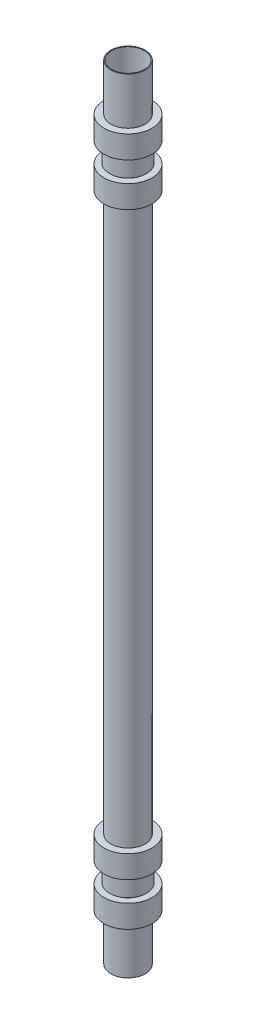
ISO-10303-21;
HEADER;
FILE_DESCRIPTION(('STEP AP214'),'2;1');
FILE_NAME('part.step','',(''),(''),'','','');
FILE_SCHEMA(('AUTOMOTIVE_DESIGN { 1 0 10303 214 1 1 1 1 }'));
ENDSEC;
DATA;
#1=APPLICATION_CONTEXT('core data for automotive mechanical design processes');
#2=APPLICATION_PROTOCOL_DEFINITION('international standard','automotive_design',2000,#1);
#3=PRODUCT_CONTEXT('',#1,'mechanical');
#4=PRODUCT('Part','Part','',(#3));
#5=PRODUCT_RELATED_PRODUCT_CATEGORY('part','',(#4));
#6=PRODUCT_DEFINITION_FORMATION('','',#4);
#7=PRODUCT_DEFINITION_CONTEXT('part definition',#1,'design');
#8=PRODUCT_DEFINITION('design','',#6,#7);
#9=PRODUCT_DEFINITION_SHAPE('','',#8);
#10=(LENGTH_UNIT() NAMED_UNIT(*) SI_UNIT(.MILLI.,.METRE.));
#11=(NAMED_UNIT(*) PLANE_ANGLE_UNIT() SI_UNIT($,.RADIAN.));
#12=(NAMED_UNIT(*) SI_UNIT($,.STERADIAN.) SOLID_ANGLE_UNIT());
#13=UNCERTAINTY_MEASURE_WITH_UNIT(LENGTH_MEASURE(1.E-05),#10,'distance_accuracy_value','');
#14=(GEOMETRIC_REPRESENTATION_CONTEXT(3) GLOBAL_UNCERTAINTY_ASSIGNED_CONTEXT((#13)) GLOBAL_UNIT_ASSIGNED_CONTEXT((#10,
#11,#12)) REPRESENTATION_CONTEXT('',''));
#15=CARTESIAN_POINT('',(0.,0.,0.));
#16=DIRECTION('',(0.,0.,1.));
#17=DIRECTION('',(1.,0.,0.));
#18=AXIS2_PLACEMENT_3D('',#15,#16,#17);
#19=CARTESIAN_POINT('',(0.,0.,0.));
#20=DIRECTION('',(0.,1.,0.));
#21=DIRECTION('',(0.,0.,1.));
#22=AXIS2_PLACEMENT_3D('',#19,#20,#21);
#23=CYLINDRICAL_SURFACE('',#22,34.0619900307438);
#24=CARTESIAN_POINT('',(0.,185.72,0.));
#25=DIRECTION('',(0.,1.,0.));
#26=DIRECTION('',(-1.,0.,0.));
#27=AXIS2_PLACEMENT_3D('',#24,#25,#26);
#28=CIRCLE('',#27,34.0619900307438);
#29=CARTESIAN_POINT('',(-34.0619900307438,185.72,0.));
#30=VERTEX_POINT('',#29);
#31=EDGE_CURVE('E120',#30,#30,#28,.F.);
#32=ORIENTED_EDGE('',*,*,#31,.T.);
#33=EDGE_LOOP('',(#32));
#34=FACE_BOUND('',#33,.T.);
#35=CARTESIAN_POINT('',(0.,1633.,0.));
#36=DIRECTION('',(0.,-1.,0.));
#37=DIRECTION('',(0.,0.,-1.));
#38=AXIS2_PLACEMENT_3D('',#35,#36,#37);
#39=CIRCLE('',#38,34.0619900307438);
#40=CARTESIAN_POINT('',(0.,1633.,-34.0619900307438));
#41=VERTEX_POINT('',#40);
#42=EDGE_CURVE('E52',#41,#41,#39,.T.);
#43=ORIENTED_EDGE('',*,*,#42,.F.);
#44=EDGE_LOOP('',(#43));
#45=FACE_BOUND('',#44,.T.);
#46=ADVANCED_FACE('F34',(#34,#45),#23,.F.);
#47=CARTESIAN_POINT('',(0.,234.69,0.));
#48=DIRECTION('',(0.,1.,0.));
#49=DIRECTION('',(0.,0.,1.));
#50=AXIS2_PLACEMENT_3D('',#47,#48,#49);
#51=CYLINDRICAL_SURFACE('',#50,36.5555198217324);
#52=CARTESIAN_POINT('',(0.,185.72,0.));
#53=DIRECTION('',(0.,1.,0.));
#54=DIRECTION('',(-1.,0.,0.));
#55=AXIS2_PLACEMENT_3D('',#52,#53,#54);
#56=CIRCLE('',#55,36.5555198217324);
#57=CARTESIAN_POINT('',(-36.5555198217324,185.72,0.));
#58=VERTEX_POINT('',#57);
#59=EDGE_CURVE('E10',#58,#58,#56,.F.);
#60=ORIENTED_EDGE('',*,*,#59,.F.);
#61=EDGE_LOOP('',(#60));
#62=FACE_BOUND('',#61,.T.);
#63=CARTESIAN_POINT('',(0.,187.72,0.));
#64=DIRECTION('',(0.,1.,0.));
#65=DIRECTION('',(0.,0.,1.));
#66=AXIS2_PLACEMENT_3D('',#63,#64,#65);
#67=CIRCLE('',#66,36.5555198217324);
#68=CARTESIAN_POINT('',(0.,187.72,36.5555198217324));
#69=VERTEX_POINT('',#68);
#70=EDGE_CURVE('E111',#69,#69,#67,.T.);
#71=ORIENTED_EDGE('',*,*,#70,.F.);
#72=EDGE_LOOP('',(#71));
#73=FACE_BOUND('',#72,.T.);
#74=ADVANCED_FACE('F151',(#62,#73),#51,.T.);
#75=CARTESIAN_POINT('',(0.,0.,0.));
#76=DIRECTION('',(0.,-1.,0.));
#77=DIRECTION('',(0.,0.,-1.));
#78=AXIS2_PLACEMENT_3D('',#75,#76,#77);
#79=CYLINDRICAL_SURFACE('',#78,50.2455198217324);
#80=CARTESIAN_POINT('',(0.,234.69,0.));
#81=DIRECTION('',(0.,-1.,0.));
#82=DIRECTION('',(0.,0.,-1.));
#83=AXIS2_PLACEMENT_3D('',#80,#81,#82);
#84=CIRCLE('',#83,50.2455198217324);
#85=CARTESIAN_POINT('',(0.,234.69,-50.2455198217324));
#86=VERTEX_POINT('',#85);
#87=EDGE_CURVE('E79',#86,#86,#84,.T.);
#88=ORIENTED_EDGE('',*,*,#87,.T.);
#89=EDGE_LOOP('',(#88));
#90=FACE_BOUND('',#89,.T.);
#91=CARTESIAN_POINT('',(0.,187.72,0.));
#92=DIRECTION('',(0.,1.,0.));
#93=DIRECTION('',(0.,0.,1.));
#94=AXIS2_PLACEMENT_3D('',#91,#92,#93);
#95=CIRCLE('',#94,50.2455198217324);
#96=CARTESIAN_POINT('',(0.,187.72,50.2455198217324));
#97=VERTEX_POINT('',#96);
#98=EDGE_CURVE('E108',#97,#97,#95,.T.);
#99=ORIENTED_EDGE('',*,*,#98,.T.);
#100=EDGE_LOOP('',(#99));
#101=FACE_BOUND('',#100,.T.);
#102=ADVANCED_FACE('F158',(#90,#101),#79,.T.);
#103=CARTESIAN_POINT('',(0.,1534.99324960301,0.));
#104=DIRECTION('',(0.,1.,0.));
#105=DIRECTION('',(0.,0.,1.));
#106=AXIS2_PLACEMENT_3D('',#103,#104,#105);
#107=CYLINDRICAL_SURFACE('',#106,36.5587642927755);
#108=CARTESIAN_POINT('',(0.,1445.28620978096,0.));
#109=DIRECTION('',(0.,1.,0.));
#110=DIRECTION('',(0.,0.,1.));
#111=AXIS2_PLACEMENT_3D('',#108,#109,#110);
#112=CIRCLE('',#111,36.5587642927756);
#113=CARTESIAN_POINT('',(0.,1445.28620978096,36.5587642927756));
#114=VERTEX_POINT('',#113);
#115=EDGE_CURVE('E60',#114,#114,#112,.T.);
#116=ORIENTED_EDGE('',*,*,#115,.T.);
#117=EDGE_LOOP('',(#116));
#118=FACE_BOUND('',#117,.T.);
#119=CARTESIAN_POINT('',(0.,1447.28620978096,0.));
#120=DIRECTION('',(0.,1.,0.));
#121=DIRECTION('',(0.,0.,1.));
#122=AXIS2_PLACEMENT_3D('',#119,#120,#121);
#123=CIRCLE('',#122,36.5587642927755);
#124=CARTESIAN_POINT('',(0.,1447.28620978096,36.5587642927756));
#125=VERTEX_POINT('',#124);
#126=EDGE_CURVE('E61',#125,#125,#123,.F.);
#127=ORIENTED_EDGE('',*,*,#126,.T.);
#128=EDGE_LOOP('',(#127));
#129=FACE_BOUND('',#128,.T.);
#130=ADVANCED_FACE('F215',(#118,#129),#107,.T.);
#131=CARTESIAN_POINT('',(0.,0.,0.));
#132=DIRECTION('',(0.,-1.,0.));
#133=DIRECTION('',(0.,0.,-1.));
#134=AXIS2_PLACEMENT_3D('',#131,#132,#133);
#135=CYLINDRICAL_SURFACE('',#134,50.2455198217324);
#136=CARTESIAN_POINT('',(0.,1398.11620978096,0.));
#137=DIRECTION('',(0.,-1.,0.));
#138=DIRECTION('',(0.,0.,-1.));
#139=AXIS2_PLACEMENT_3D('',#136,#137,#138);
#140=CIRCLE('',#139,50.2455198217324);
#141=CARTESIAN_POINT('',(0.,1398.11620978096,-50.2455198217324));
#142=VERTEX_POINT('',#141);
#143=EDGE_CURVE('E70',#142,#142,#140,.T.);
#144=ORIENTED_EDGE('',*,*,#143,.F.);
#145=EDGE_LOOP('',(#144));
#146=FACE_BOUND('',#145,.T.);
#147=CARTESIAN_POINT('',(0.,1445.28620978096,0.));
#148=DIRECTION('',(0.,1.,0.));
#149=DIRECTION('',(0.,0.,1.));
#150=AXIS2_PLACEMENT_3D('',#147,#148,#149);
#151=CIRCLE('',#150,50.2455198217324);
#152=CARTESIAN_POINT('',(0.,1445.28620978096,50.2455198217324));
#153=VERTEX_POINT('',#152);
#154=EDGE_CURVE('E97',#153,#153,#151,.T.);
#155=ORIENTED_EDGE('',*,*,#154,.F.);
#156=EDGE_LOOP('',(#155));
#157=FACE_BOUND('',#156,.T.);
#158=ADVANCED_FACE('F225',(#146,#157),#135,.T.);
#159=CARTESIAN_POINT('',(-50.2455198217324,1398.11620978096,0.));
#160=DIRECTION('',(0.,1.,0.));
#161=DIRECTION('',(0.,0.,1.));
#162=AXIS2_PLACEMENT_3D('',#159,#160,#161);
#163=PLANE('',#162);
#164=CARTESIAN_POINT('',(0.,1398.11620978096,0.));
#165=DIRECTION('',(0.,-1.,0.));
#166=DIRECTION('',(0.,0.,-1.));
#167=AXIS2_PLACEMENT_3D('',#164,#165,#166);
#168=CIRCLE('',#167,35.8382242883202);
#169=CARTESIAN_POINT('',(0.,1398.11620978096,-35.8382242883202));
#170=VERTEX_POINT('',#169);
#171=EDGE_CURVE('E73',#170,#170,#168,.T.);
#172=ORIENTED_EDGE('',*,*,#171,.F.);
#173=EDGE_LOOP('',(#172));
#174=FACE_BOUND('',#173,.T.);
#175=ORIENTED_EDGE('',*,*,#143,.T.);
#176=EDGE_LOOP('',(#175));
#177=FACE_BOUND('',#176,.T.);
#178=ADVANCED_FACE('F236',(#174,#177),#163,.F.);
#179=CARTESIAN_POINT('',(0.,0.,0.));
#180=DIRECTION('',(0.,-1.,0.));
#181=DIRECTION('',(0.,0.,-1.));
#182=AXIS2_PLACEMENT_3D('',#179,#180,#181);
#183=CYLINDRICAL_SURFACE('',#182,35.8382242883202);
#184=CARTESIAN_POINT('',(0.,234.69,0.));
#185=DIRECTION('',(0.,-1.,0.));
#186=DIRECTION('',(0.,0.,-1.));
#187=AXIS2_PLACEMENT_3D('',#184,#185,#186);
#188=CIRCLE('',#187,35.8382242883201);
#189=CARTESIAN_POINT('',(0.,234.69,-35.8382242883201));
#190=VERTEX_POINT('',#189);
#191=EDGE_CURVE('E76',#190,#190,#188,.T.);
#192=ORIENTED_EDGE('',*,*,#191,.F.);
#193=EDGE_LOOP('',(#192));
#194=FACE_BOUND('',#193,.T.);
#195=ORIENTED_EDGE('',*,*,#171,.T.);
#196=EDGE_LOOP('',(#195));
#197=FACE_BOUND('',#196,.T.);
#198=ADVANCED_FACE('F232',(#194,#197),#183,.T.);
#199=CARTESIAN_POINT('',(-35.8382242883201,234.69,0.));
#200=DIRECTION('',(0.,-1.,0.));
#201=DIRECTION('',(0.,0.,-1.));
#202=AXIS2_PLACEMENT_3D('',#199,#200,#201);
#203=PLANE('',#202);
#204=ORIENTED_EDGE('',*,*,#87,.F.);
#205=EDGE_LOOP('',(#204));
#206=FACE_BOUND('',#205,.T.);
#207=ORIENTED_EDGE('',*,*,#191,.T.);
#208=EDGE_LOOP('',(#207));
#209=FACE_BOUND('',#208,.T.);
#210=ADVANCED_FACE('F228',(#206,#209),#203,.F.);
#211=CARTESIAN_POINT('',(0.,1445.28620978096,-50.2455198217324));
#212=DIRECTION('',(0.,1.,0.));
#213=DIRECTION('',(0.,0.,1.));
#214=AXIS2_PLACEMENT_3D('',#211,#212,#213);
#215=PLANE('',#214);
#216=ORIENTED_EDGE('',*,*,#154,.T.);
#217=EDGE_LOOP('',(#216));
#218=FACE_BOUND('',#217,.T.);
#219=ORIENTED_EDGE('',*,*,#115,.F.);
#220=EDGE_LOOP('',(#219));
#221=FACE_BOUND('',#220,.T.);
#222=ADVANCED_FACE('F231',(#218,#221),#215,.T.);
#223=CARTESIAN_POINT('',(0.,1485.8221452741,0.));
#224=DIRECTION('',(0.,-1.,0.));
#225=DIRECTION('',(0.,0.,-1.));
#226=AXIS2_PLACEMENT_3D('',#223,#224,#225);
#227=PLANE('',#226);
#228=CARTESIAN_POINT('',(0.,1485.8221452741,0.));
#229=DIRECTION('',(0.,-1.,0.));
#230=DIRECTION('',(0.,0.,-1.));
#231=AXIS2_PLACEMENT_3D('',#228,#229,#230);
#232=CIRCLE('',#231,36.5587642927755);
#233=CARTESIAN_POINT('',(0.,1485.8221452741,-36.5587642927756));
#234=VERTEX_POINT('',#233);
#235=EDGE_CURVE('E57',#234,#234,#232,.F.);
#236=ORIENTED_EDGE('',*,*,#235,.F.);
#237=EDGE_LOOP('',(#236));
#238=FACE_BOUND('',#237,.T.);
#239=CARTESIAN_POINT('',(0.,1485.8221452741,0.));
#240=DIRECTION('',(0.,1.,0.));
#241=DIRECTION('',(0.,0.,1.));
#242=AXIS2_PLACEMENT_3D('',#239,#240,#241);
#243=CIRCLE('',#242,38.6809051523207);
#244=CARTESIAN_POINT('',(0.,1485.8221452741,38.6809051523207));
#245=VERTEX_POINT('',#244);
#246=EDGE_CURVE('E63',#245,#245,#243,.T.);
#247=ORIENTED_EDGE('',*,*,#246,.T.);
#248=EDGE_LOOP('',(#247));
#249=FACE_BOUND('',#248,.T.);
#250=ADVANCED_FACE('F268',(#238,#249),#227,.F.);
#251=CARTESIAN_POINT('',(0.,1487.8221452741,0.));
#252=DIRECTION('',(0.,1.,0.));
#253=DIRECTION('',(0.,0.,1.));
#254=AXIS2_PLACEMENT_3D('',#251,#252,#253);
#255=CYLINDRICAL_SURFACE('',#254,38.6809051523207);
#256=ORIENTED_EDGE('',*,*,#246,.F.);
#257=EDGE_LOOP('',(#256));
#258=FACE_BOUND('',#257,.T.);
#259=CARTESIAN_POINT('',(0.,1447.28620978096,0.));
#260=DIRECTION('',(0.,1.,0.));
#261=DIRECTION('',(0.,0.,1.));
#262=AXIS2_PLACEMENT_3D('',#259,#260,#261);
#263=CIRCLE('',#262,38.6809051523207);
#264=CARTESIAN_POINT('',(0.,1447.28620978096,38.6809051523207));
#265=VERTEX_POINT('',#264);
#266=EDGE_CURVE('E55',#265,#265,#263,.T.);
#267=ORIENTED_EDGE('',*,*,#266,.T.);
#268=EDGE_LOOP('',(#267));
#269=FACE_BOUND('',#268,.T.);
#270=ADVANCED_FACE('F259',(#258,#269),#255,.T.);
#271=CARTESIAN_POINT('',(0.,1447.28620978096,-38.6809051523207));
#272=DIRECTION('',(0.,1.,0.));
#273=DIRECTION('',(0.,0.,1.));
#274=AXIS2_PLACEMENT_3D('',#271,#272,#273);
#275=PLANE('',#274);
#276=ORIENTED_EDGE('',*,*,#126,.F.);
#277=EDGE_LOOP('',(#276));
#278=FACE_BOUND('',#277,.T.);
#279=ORIENTED_EDGE('',*,*,#266,.F.);
#280=EDGE_LOOP('',(#279));
#281=FACE_BOUND('',#280,.T.);
#282=ADVANCED_FACE('F254',(#278,#281),#275,.F.);
#283=CARTESIAN_POINT('',(0.,1633.,0.));
#284=DIRECTION('',(0.,-1.,0.));
#285=DIRECTION('',(0.,0.,-1.));
#286=AXIS2_PLACEMENT_3D('',#283,#284,#285);
#287=PLANE('',#286);
#288=ORIENTED_EDGE('',*,*,#42,.T.);
#289=EDGE_LOOP('',(#288));
#290=FACE_BOUND('',#289,.T.);
#291=CARTESIAN_POINT('',(0.,1633.,0.));
#292=DIRECTION('',(0.,-1.,0.));
#293=DIRECTION('',(0.,0.,-1.));
#294=AXIS2_PLACEMENT_3D('',#291,#292,#293);
#295=CIRCLE('',#294,35.8382242883203);
#296=CARTESIAN_POINT('',(0.,1633.,-35.8382242883203));
#297=VERTEX_POINT('',#296);
#298=EDGE_CURVE('E45',#297,#297,#295,.T.);
#299=ORIENTED_EDGE('',*,*,#298,.F.);
#300=EDGE_LOOP('',(#299));
#301=FACE_BOUND('',#300,.T.);
#302=ADVANCED_FACE('F251',(#290,#301),#287,.F.);
#303=CARTESIAN_POINT('',(0.,0.,0.));
#304=DIRECTION('',(0.,-1.,0.));
#305=DIRECTION('',(0.,0.,-1.));
#306=AXIS2_PLACEMENT_3D('',#303,#304,#305);
#307=CYLINDRICAL_SURFACE('',#306,35.8382242883203);
#308=CARTESIAN_POINT('',(0.,1534.99324960301,0.));
#309=DIRECTION('',(0.,-1.,0.));
#310=DIRECTION('',(0.,0.,-1.));
#311=AXIS2_PLACEMENT_3D('',#308,#309,#310);
#312=CIRCLE('',#311,35.8382242883203);
#313=CARTESIAN_POINT('',(0.,1534.99324960301,-35.8382242883203));
#314=VERTEX_POINT('',#313);
#315=EDGE_CURVE('E49',#314,#314,#312,.T.);
#316=ORIENTED_EDGE('',*,*,#315,.F.);
#317=EDGE_LOOP('',(#316));
#318=FACE_BOUND('',#317,.T.);
#319=ORIENTED_EDGE('',*,*,#298,.T.);
#320=EDGE_LOOP('',(#319));
#321=FACE_BOUND('',#320,.T.);
#322=ADVANCED_FACE('F248',(#318,#321),#307,.T.);
#323=CARTESIAN_POINT('',(-35.8382242883203,1534.99324960301,0.));
#324=DIRECTION('',(0.,-1.,0.));
#325=DIRECTION('',(0.,0.,-1.));
#326=AXIS2_PLACEMENT_3D('',#323,#324,#325);
#327=PLANE('',#326);
#328=CARTESIAN_POINT('',(0.,1534.99324960301,0.));
#329=DIRECTION('',(0.,-1.,0.));
#330=DIRECTION('',(0.,0.,-1.));
#331=AXIS2_PLACEMENT_3D('',#328,#329,#330);
#332=CIRCLE('',#331,50.2455198217324);
#333=CARTESIAN_POINT('',(0.,1534.99324960301,-50.2455198217324));
#334=VERTEX_POINT('',#333);
#335=EDGE_CURVE('E67',#334,#334,#332,.T.);
#336=ORIENTED_EDGE('',*,*,#335,.F.);
#337=EDGE_LOOP('',(#336));
#338=FACE_BOUND('',#337,.T.);
#339=ORIENTED_EDGE('',*,*,#315,.T.);
#340=EDGE_LOOP('',(#339));
#341=FACE_BOUND('',#340,.T.);
#342=ADVANCED_FACE('F244',(#338,#341),#327,.F.);
#343=ORIENTED_EDGE('',*,*,#335,.T.);
#344=EDGE_LOOP('',(#343));
#345=FACE_BOUND('',#344,.T.);
#346=CARTESIAN_POINT('',(0.,1487.8221452741,0.));
#347=DIRECTION('',(0.,1.,0.));
#348=DIRECTION('',(0.,0.,1.));
#349=AXIS2_PLACEMENT_3D('',#346,#347,#348);
#350=CIRCLE('',#349,50.2455198217324);
#351=CARTESIAN_POINT('',(0.,1487.8221452741,50.2455198217324));
#352=VERTEX_POINT('',#351);
#353=EDGE_CURVE('E94',#352,#352,#350,.T.);
#354=ORIENTED_EDGE('',*,*,#353,.T.);
#355=EDGE_LOOP('',(#354));
#356=FACE_BOUND('',#355,.T.);
#357=ADVANCED_FACE('F241',(#345,#356),#135,.T.);
#358=CARTESIAN_POINT('',(0.,1487.8221452741,-36.5587642927755));
#359=DIRECTION('',(0.,-1.,0.));
#360=DIRECTION('',(0.,0.,-1.));
#361=AXIS2_PLACEMENT_3D('',#358,#359,#360);
#362=PLANE('',#361);
#363=CARTESIAN_POINT('',(0.,1487.8221452741,0.));
#364=DIRECTION('',(0.,1.,0.));
#365=DIRECTION('',(0.,0.,1.));
#366=AXIS2_PLACEMENT_3D('',#363,#364,#365);
#367=CIRCLE('',#366,36.5587642927755);
#368=CARTESIAN_POINT('',(0.,1487.8221452741,36.5587642927755));
#369=VERTEX_POINT('',#368);
#370=EDGE_CURVE('E91',#369,#369,#367,.T.);
#371=ORIENTED_EDGE('',*,*,#370,.T.);
#372=EDGE_LOOP('',(#371));
#373=FACE_BOUND('',#372,.T.);
#374=ORIENTED_EDGE('',*,*,#353,.F.);
#375=EDGE_LOOP('',(#374));
#376=FACE_BOUND('',#375,.T.);
#377=ADVANCED_FACE('F212',(#373,#376),#362,.T.);
#378=ORIENTED_EDGE('',*,*,#370,.F.);
#379=EDGE_LOOP('',(#378));
#380=FACE_BOUND('',#379,.T.);
#381=ORIENTED_EDGE('',*,*,#235,.T.);
#382=EDGE_LOOP('',(#381));
#383=FACE_BOUND('',#382,.T.);
#384=ADVANCED_FACE('F207',(#380,#383),#107,.T.);
#385=CARTESIAN_POINT('',(0.,187.72,-50.2455198217324));
#386=DIRECTION('',(0.,-1.,0.));
#387=DIRECTION('',(0.,0.,-1.));
#388=AXIS2_PLACEMENT_3D('',#385,#386,#387);
#389=PLANE('',#388);
#390=ORIENTED_EDGE('',*,*,#70,.T.);
#391=EDGE_LOOP('',(#390));
#392=FACE_BOUND('',#391,.T.);
#393=ORIENTED_EDGE('',*,*,#98,.F.);
#394=EDGE_LOOP('',(#393));
#395=FACE_BOUND('',#394,.T.);
#396=ADVANCED_FACE('F147',(#392,#395),#389,.T.);
#397=CARTESIAN_POINT('',(38.68,147.18,0.));
#398=DIRECTION('',(0.,-1.,0.));
#399=DIRECTION('',(1.,0.,0.));
#400=AXIS2_PLACEMENT_3D('',#397,#398,#399);
#401=PLANE('',#400);
#402=CARTESIAN_POINT('',(0.,147.18,0.));
#403=DIRECTION('',(0.,-1.,0.));
#404=DIRECTION('',(1.,0.,0.));
#405=AXIS2_PLACEMENT_3D('',#402,#403,#404);
#406=CIRCLE('',#405,36.5555198217324);
#407=CARTESIAN_POINT('',(36.5555198217324,147.18,0.));
#408=VERTEX_POINT('',#407);
#409=EDGE_CURVE('E41',#408,#408,#406,.F.);
#410=ORIENTED_EDGE('',*,*,#409,.T.);
#411=EDGE_LOOP('',(#410));
#412=FACE_BOUND('',#411,.T.);
#413=CARTESIAN_POINT('',(0.,147.18,0.));
#414=DIRECTION('',(0.,-1.,0.));
#415=DIRECTION('',(1.,0.,0.));
#416=AXIS2_PLACEMENT_3D('',#413,#414,#415);
#417=CIRCLE('',#416,38.68);
#418=CARTESIAN_POINT('',(38.68,147.18,0.));
#419=VERTEX_POINT('',#418);
#420=EDGE_CURVE('E129',#419,#419,#417,.T.);
#421=ORIENTED_EDGE('',*,*,#420,.T.);
#422=EDGE_LOOP('',(#421));
#423=FACE_BOUND('',#422,.T.);
#424=ADVANCED_FACE('F133',(#412,#423),#401,.T.);
#425=CARTESIAN_POINT('',(0.,145.18,0.));
#426=DIRECTION('',(0.,-1.,0.));
#427=DIRECTION('',(1.,0.,0.));
#428=AXIS2_PLACEMENT_3D('',#425,#426,#427);
#429=CYLINDRICAL_SURFACE('',#428,38.68);
#430=CARTESIAN_POINT('',(0.,185.72,0.));
#431=DIRECTION('',(0.,-1.,0.));
#432=DIRECTION('',(1.,0.,0.));
#433=AXIS2_PLACEMENT_3D('',#430,#431,#432);
#434=CIRCLE('',#433,38.68);
#435=CARTESIAN_POINT('',(38.68,185.72,0.));
#436=VERTEX_POINT('',#435);
#437=EDGE_CURVE('E126',#436,#436,#434,.T.);
#438=ORIENTED_EDGE('',*,*,#437,.T.);
#439=EDGE_LOOP('',(#438));
#440=FACE_BOUND('',#439,.T.);
#441=ORIENTED_EDGE('',*,*,#420,.F.);
#442=EDGE_LOOP('',(#441));
#443=FACE_BOUND('',#442,.T.);
#444=ADVANCED_FACE('F135',(#440,#443),#429,.T.);
#445=CARTESIAN_POINT('',(0.,185.72,0.));
#446=DIRECTION('',(0.,1.,0.));
#447=DIRECTION('',(-1.,0.,0.));
#448=AXIS2_PLACEMENT_3D('',#445,#446,#447);
#449=PLANE('',#448);
#450=ORIENTED_EDGE('',*,*,#59,.T.);
#451=EDGE_LOOP('',(#450));
#452=FACE_BOUND('',#451,.T.);
#453=ORIENTED_EDGE('',*,*,#437,.F.);
#454=EDGE_LOOP('',(#453));
#455=FACE_BOUND('',#454,.T.);
#456=ADVANCED_FACE('F137',(#452,#455),#449,.T.);
#457=CARTESIAN_POINT('',(0.,0.,0.));
#458=DIRECTION('',(0.,-1.,0.));
#459=DIRECTION('',(0.,0.,-1.));
#460=AXIS2_PLACEMENT_3D('',#457,#458,#459);
#461=CYLINDRICAL_SURFACE('',#460,35.8382242883201);
#462=CARTESIAN_POINT('',(0.,0.,0.));
#463=DIRECTION('',(0.,-1.,0.));
#464=DIRECTION('',(0.,0.,-1.));
#465=AXIS2_PLACEMENT_3D('',#462,#463,#464);
#466=CIRCLE('',#465,35.8382242883201);
#467=CARTESIAN_POINT('',(0.,0.,-35.8382242883201));
#468=VERTEX_POINT('',#467);
#469=EDGE_CURVE('E88',#468,#468,#466,.T.);
#470=ORIENTED_EDGE('',*,*,#469,.F.);
#471=EDGE_LOOP('',(#470));
#472=FACE_BOUND('',#471,.T.);
#473=CARTESIAN_POINT('',(0.,98.01,0.));
#474=DIRECTION('',(0.,-1.,0.));
#475=DIRECTION('',(0.,0.,-1.));
#476=AXIS2_PLACEMENT_3D('',#473,#474,#475);
#477=CIRCLE('',#476,35.8382242883201);
#478=CARTESIAN_POINT('',(0.,98.01,-35.8382242883201));
#479=VERTEX_POINT('',#478);
#480=EDGE_CURVE('E85',#479,#479,#477,.T.);
#481=ORIENTED_EDGE('',*,*,#480,.T.);
#482=EDGE_LOOP('',(#481));
#483=FACE_BOUND('',#482,.T.);
#484=ADVANCED_FACE('F144',(#472,#483),#461,.T.);
#485=CARTESIAN_POINT('',(-35.8382242883201,0.,0.));
#486=DIRECTION('',(0.,1.,0.));
#487=DIRECTION('',(0.,0.,1.));
#488=AXIS2_PLACEMENT_3D('',#485,#486,#487);
#489=PLANE('',#488);
#490=CARTESIAN_POINT('',(0.,0.,0.));
#491=DIRECTION('',(0.,1.,0.));
#492=DIRECTION('',(0.,0.,1.));
#493=AXIS2_PLACEMENT_3D('',#490,#491,#492);
#494=CIRCLE('',#493,34.0619900307438);
#495=CARTESIAN_POINT('',(0.,0.,34.0619900307438));
#496=VERTEX_POINT('',#495);
#497=EDGE_CURVE('E56',#496,#496,#494,.T.);
#498=ORIENTED_EDGE('',*,*,#497,.T.);
#499=EDGE_LOOP('',(#498));
#500=FACE_BOUND('',#499,.T.);
#501=ORIENTED_EDGE('',*,*,#469,.T.);
#502=EDGE_LOOP('',(#501));
#503=FACE_BOUND('',#502,.T.);
#504=ADVANCED_FACE('F36',(#500,#503),#489,.F.);
#505=CARTESIAN_POINT('',(0.,147.18,0.));
#506=DIRECTION('',(0.,-1.,0.));
#507=DIRECTION('',(1.,0.,0.));
#508=AXIS2_PLACEMENT_3D('',#505,#506,#507);
#509=CIRCLE('',#508,34.0619900307438);
#510=CARTESIAN_POINT('',(34.0619900307438,147.18,0.));
#511=VERTEX_POINT('',#510);
#512=EDGE_CURVE('E123',#511,#511,#509,.F.);
#513=ORIENTED_EDGE('',*,*,#512,.T.);
#514=EDGE_LOOP('',(#513));
#515=FACE_BOUND('',#514,.T.);
#516=ORIENTED_EDGE('',*,*,#497,.F.);
#517=EDGE_LOOP('',(#516));
#518=FACE_BOUND('',#517,.T.);
#519=ADVANCED_FACE('F154',(#515,#518),#23,.F.);
#520=CARTESIAN_POINT('',(-50.2455198217324,98.01,0.));
#521=DIRECTION('',(0.,1.,0.));
#522=DIRECTION('',(0.,0.,1.));
#523=AXIS2_PLACEMENT_3D('',#520,#521,#522);
#524=PLANE('',#523);
#525=ORIENTED_EDGE('',*,*,#480,.F.);
#526=EDGE_LOOP('',(#525));
#527=FACE_BOUND('',#526,.T.);
#528=CARTESIAN_POINT('',(0.,98.01,0.));
#529=DIRECTION('',(0.,-1.,0.));
#530=DIRECTION('',(0.,0.,-1.));
#531=AXIS2_PLACEMENT_3D('',#528,#529,#530);
#532=CIRCLE('',#531,50.2455198217324);
#533=CARTESIAN_POINT('',(0.,98.01,-50.2455198217324));
#534=VERTEX_POINT('',#533);
#535=EDGE_CURVE('E82',#534,#534,#532,.T.);
#536=ORIENTED_EDGE('',*,*,#535,.T.);
#537=EDGE_LOOP('',(#536));
#538=FACE_BOUND('',#537,.T.);
#539=ADVANCED_FACE('F166',(#527,#538),#524,.F.);
#540=ORIENTED_EDGE('',*,*,#535,.F.);
#541=EDGE_LOOP('',(#540));
#542=FACE_BOUND('',#541,.T.);
#543=CARTESIAN_POINT('',(0.,145.18,0.));
#544=DIRECTION('',(0.,1.,0.));
#545=DIRECTION('',(0.,0.,1.));
#546=AXIS2_PLACEMENT_3D('',#543,#544,#545);
#547=CIRCLE('',#546,50.2455198217324);
#548=CARTESIAN_POINT('',(0.,145.18,50.2455198217324));
#549=VERTEX_POINT('',#548);
#550=EDGE_CURVE('E117',#549,#549,#547,.T.);
#551=ORIENTED_EDGE('',*,*,#550,.F.);
#552=EDGE_LOOP('',(#551));
#553=FACE_BOUND('',#552,.T.);
#554=ADVANCED_FACE('F172',(#542,#553),#79,.T.);
#555=CARTESIAN_POINT('',(0.,145.18,-36.5555198217324));
#556=DIRECTION('',(0.,1.,0.));
#557=DIRECTION('',(0.,0.,1.));
#558=AXIS2_PLACEMENT_3D('',#555,#556,#557);
#559=PLANE('',#558);
#560=ORIENTED_EDGE('',*,*,#550,.T.);
#561=EDGE_LOOP('',(#560));
#562=FACE_BOUND('',#561,.T.);
#563=CARTESIAN_POINT('',(0.,145.18,0.));
#564=DIRECTION('',(0.,1.,0.));
#565=DIRECTION('',(0.,0.,1.));
#566=AXIS2_PLACEMENT_3D('',#563,#564,#565);
#567=CIRCLE('',#566,36.5555198217324);
#568=CARTESIAN_POINT('',(0.,145.18,36.5555198217324));
#569=VERTEX_POINT('',#568);
#570=EDGE_CURVE('E114',#569,#569,#567,.T.);
#571=ORIENTED_EDGE('',*,*,#570,.F.);
#572=EDGE_LOOP('',(#571));
#573=FACE_BOUND('',#572,.T.);
#574=ADVANCED_FACE('F191',(#562,#573),#559,.T.);
#575=ORIENTED_EDGE('',*,*,#409,.F.);
#576=EDGE_LOOP('',(#575));
#577=FACE_BOUND('',#576,.T.);
#578=ORIENTED_EDGE('',*,*,#570,.T.);
#579=EDGE_LOOP('',(#578));
#580=FACE_BOUND('',#579,.T.);
#581=ADVANCED_FACE('F161',(#577,#580),#51,.T.);
#582=ORIENTED_EDGE('',*,*,#512,.F.);
#583=EDGE_LOOP('',(#582));
#584=FACE_BOUND('',#583,.T.);
#585=ADVANCED_FACE('F149',(#584),#401,.T.);
#586=ORIENTED_EDGE('',*,*,#31,.F.);
#587=EDGE_LOOP('',(#586));
#588=FACE_BOUND('',#587,.T.);
#589=ADVANCED_FACE('F146',(#588),#449,.T.);
#590=CLOSED_SHELL('',(#46,#74,#102,#130,#158,#178,#198,#210,#222,#250,#270,#282,#302,#322,#342,
#357,#377,#384,#396,#424,#444,#456,#484,#504,#519,#539,#554,#574,#581,#585,#589));
#591=MANIFOLD_SOLID_BREP('B2',#590);
#592=ADVANCED_BREP_SHAPE_REPRESENTATION('',(#18,#591),#14);
#593=SHAPE_DEFINITION_REPRESENTATION(#9,#592);
ENDSEC;
END-ISO-10303-21;
